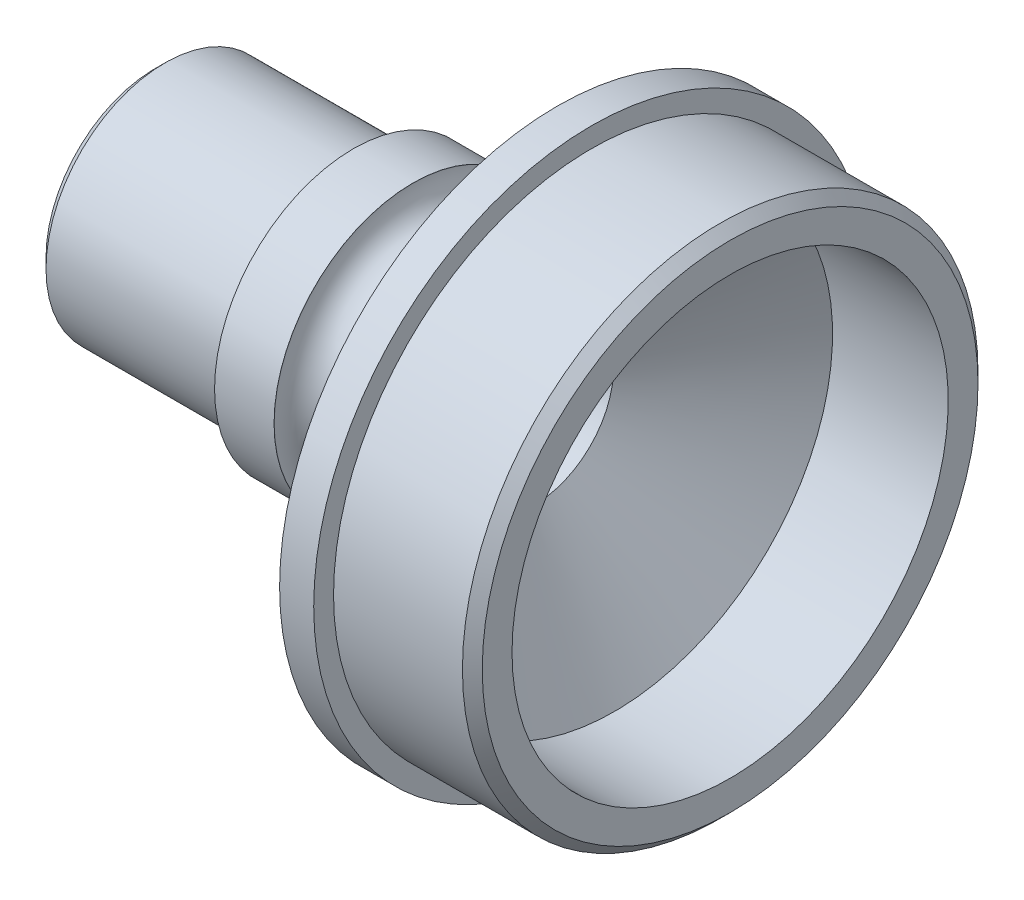
ISO-10303-21;
HEADER;
FILE_DESCRIPTION(('STEP AP214'),'2;1');
FILE_NAME('part.step','',(''),(''),'','','');
FILE_SCHEMA(('AUTOMOTIVE_DESIGN { 1 0 10303 214 1 1 1 1 }'));
ENDSEC;
DATA;
#1=APPLICATION_CONTEXT('core data for automotive mechanical design processes');
#2=APPLICATION_PROTOCOL_DEFINITION('international standard','automotive_design',2000,#1);
#3=PRODUCT_CONTEXT('',#1,'mechanical');
#4=PRODUCT('Part','Part','',(#3));
#5=PRODUCT_RELATED_PRODUCT_CATEGORY('part','',(#4));
#6=PRODUCT_DEFINITION_FORMATION('','',#4);
#7=PRODUCT_DEFINITION_CONTEXT('part definition',#1,'design');
#8=PRODUCT_DEFINITION('design','',#6,#7);
#9=PRODUCT_DEFINITION_SHAPE('','',#8);
#10=(LENGTH_UNIT() NAMED_UNIT(*) SI_UNIT(.MILLI.,.METRE.));
#11=(NAMED_UNIT(*) PLANE_ANGLE_UNIT() SI_UNIT($,.RADIAN.));
#12=(NAMED_UNIT(*) SI_UNIT($,.STERADIAN.) SOLID_ANGLE_UNIT());
#13=UNCERTAINTY_MEASURE_WITH_UNIT(LENGTH_MEASURE(1.E-05),#10,'distance_accuracy_value','');
#14=(GEOMETRIC_REPRESENTATION_CONTEXT(3) GLOBAL_UNCERTAINTY_ASSIGNED_CONTEXT((#13)) GLOBAL_UNIT_ASSIGNED_CONTEXT((#10,
#11,#12)) REPRESENTATION_CONTEXT('',''));
#15=CARTESIAN_POINT('',(0.,0.,0.));
#16=DIRECTION('',(0.,0.,1.));
#17=DIRECTION('',(1.,0.,0.));
#18=AXIS2_PLACEMENT_3D('',#15,#16,#17);
#19=CARTESIAN_POINT('',(-6.13336789882657,0.,0.));
#20=DIRECTION('',(1.,0.,0.));
#21=DIRECTION('',(0.,0.,-1.));
#22=AXIS2_PLACEMENT_3D('',#19,#20,#21);
#23=CONICAL_SURFACE('',#22,6.35604902157912,1.04719755119659);
#24=CARTESIAN_POINT('',(-1.72013074376293,0.,0.));
#25=DIRECTION('',(-1.,0.,0.));
#26=DIRECTION('',(0.,0.,1.));
#27=AXIS2_PLACEMENT_3D('',#24,#25,#26);
#28=CIRCLE('',#27,14.);
#29=CARTESIAN_POINT('',(-1.72013074376293,0.,14.));
#30=VERTEX_POINT('',#29);
#31=EDGE_CURVE('E87',#30,#30,#28,.T.);
#32=ORIENTED_EDGE('',*,*,#31,.T.);
#33=EDGE_LOOP('',(#32));
#34=FACE_BOUND('',#33,.T.);
#35=CARTESIAN_POINT('',(-6.13336789882657,0.,0.));
#36=DIRECTION('',(-1.,0.,0.));
#37=DIRECTION('',(0.,0.,1.));
#38=AXIS2_PLACEMENT_3D('',#35,#36,#37);
#39=CIRCLE('',#38,6.35604902157912);
#40=CARTESIAN_POINT('',(-6.13336789882657,0.,6.35604902157912));
#41=VERTEX_POINT('',#40);
#42=EDGE_CURVE('E51',#41,#41,#39,.T.);
#43=ORIENTED_EDGE('',*,*,#42,.F.);
#44=EDGE_LOOP('',(#43));
#45=FACE_BOUND('',#44,.T.);
#46=ADVANCED_FACE('F32',(#34,#45),#23,.T.);
#47=CARTESIAN_POINT('',(0.,0.,0.));
#48=DIRECTION('',(-1.,0.,0.));
#49=DIRECTION('',(0.,0.,1.));
#50=AXIS2_PLACEMENT_3D('',#47,#48,#49);
#51=CYLINDRICAL_SURFACE('',#50,6.35604902157911);
#52=ORIENTED_EDGE('',*,*,#42,.T.);
#53=EDGE_LOOP('',(#52));
#54=FACE_BOUND('',#53,.T.);
#55=CARTESIAN_POINT('',(-6.14007077130874,0.,0.));
#56=DIRECTION('',(-1.,0.,0.));
#57=DIRECTION('',(0.,0.,1.));
#58=AXIS2_PLACEMENT_3D('',#55,#56,#57);
#59=CIRCLE('',#58,6.35604902157911);
#60=CARTESIAN_POINT('',(-6.14007077130874,0.,6.35604902157911));
#61=VERTEX_POINT('',#60);
#62=EDGE_CURVE('E54',#61,#61,#59,.T.);
#63=ORIENTED_EDGE('',*,*,#62,.F.);
#64=EDGE_LOOP('',(#63));
#65=FACE_BOUND('',#64,.T.);
#66=ADVANCED_FACE('F110',(#54,#65),#51,.T.);
#67=CARTESIAN_POINT('',(-7.5,0.,0.));
#68=DIRECTION('',(-1.,0.,0.));
#69=DIRECTION('',(0.,0.,1.));
#70=AXIS2_PLACEMENT_3D('',#67,#68,#69);
#71=TOROIDAL_SURFACE('',#70,6.98897278709213,1.5);
#72=ORIENTED_EDGE('',*,*,#62,.T.);
#73=EDGE_LOOP('',(#72));
#74=FACE_BOUND('',#73,.T.);
#75=CARTESIAN_POINT('',(-9.,0.,0.));
#76=DIRECTION('',(-1.,0.,0.));
#77=DIRECTION('',(0.,0.,1.));
#78=AXIS2_PLACEMENT_3D('',#75,#76,#77);
#79=CIRCLE('',#78,6.98897278709213);
#80=CARTESIAN_POINT('',(-9.,0.,6.98897278709213));
#81=VERTEX_POINT('',#80);
#82=EDGE_CURVE('E57',#81,#81,#79,.T.);
#83=ORIENTED_EDGE('',*,*,#82,.F.);
#84=EDGE_LOOP('',(#83));
#85=FACE_BOUND('',#84,.T.);
#86=ADVANCED_FACE('F114',(#74,#85),#71,.F.);
#87=CARTESIAN_POINT('',(-9.,7.,0.));
#88=DIRECTION('',(1.,0.,0.));
#89=DIRECTION('',(0.,0.,-1.));
#90=AXIS2_PLACEMENT_3D('',#87,#88,#89);
#91=PLANE('',#90);
#92=ORIENTED_EDGE('',*,*,#82,.T.);
#93=EDGE_LOOP('',(#92));
#94=FACE_BOUND('',#93,.T.);
#95=CARTESIAN_POINT('',(-9.,0.,0.));
#96=DIRECTION('',(-1.,0.,0.));
#97=DIRECTION('',(0.,0.,1.));
#98=AXIS2_PLACEMENT_3D('',#95,#96,#97);
#99=CIRCLE('',#98,7.);
#100=CARTESIAN_POINT('',(-9.,0.,7.));
#101=VERTEX_POINT('',#100);
#102=EDGE_CURVE('E60',#101,#101,#99,.T.);
#103=ORIENTED_EDGE('',*,*,#102,.F.);
#104=EDGE_LOOP('',(#103));
#105=FACE_BOUND('',#104,.T.);
#106=ADVANCED_FACE('F119',(#94,#105),#91,.T.);
#107=CARTESIAN_POINT('',(0.,0.,0.));
#108=DIRECTION('',(-1.,0.,0.));
#109=DIRECTION('',(0.,0.,1.));
#110=AXIS2_PLACEMENT_3D('',#107,#108,#109);
#111=CYLINDRICAL_SURFACE('',#110,7.);
#112=ORIENTED_EDGE('',*,*,#102,.T.);
#113=EDGE_LOOP('',(#112));
#114=FACE_BOUND('',#113,.T.);
#115=CARTESIAN_POINT('',(-12.,0.,0.));
#116=DIRECTION('',(-1.,0.,0.));
#117=DIRECTION('',(0.,0.,1.));
#118=AXIS2_PLACEMENT_3D('',#115,#116,#117);
#119=CIRCLE('',#118,7.);
#120=CARTESIAN_POINT('',(-12.,0.,7.));
#121=VERTEX_POINT('',#120);
#122=EDGE_CURVE('E63',#121,#121,#119,.T.);
#123=ORIENTED_EDGE('',*,*,#122,.F.);
#124=EDGE_LOOP('',(#123));
#125=FACE_BOUND('',#124,.T.);
#126=ADVANCED_FACE('F126',(#114,#125),#111,.T.);
#127=CARTESIAN_POINT('',(-12.,6.,0.));
#128=DIRECTION('',(-1.,0.,0.));
#129=DIRECTION('',(0.,0.,1.));
#130=AXIS2_PLACEMENT_3D('',#127,#128,#129);
#131=PLANE('',#130);
#132=ORIENTED_EDGE('',*,*,#122,.T.);
#133=EDGE_LOOP('',(#132));
#134=FACE_BOUND('',#133,.T.);
#135=CARTESIAN_POINT('',(-12.,0.,0.));
#136=DIRECTION('',(-1.,0.,0.));
#137=DIRECTION('',(0.,0.,1.));
#138=AXIS2_PLACEMENT_3D('',#135,#136,#137);
#139=CIRCLE('',#138,6.);
#140=CARTESIAN_POINT('',(-12.,0.,6.));
#141=VERTEX_POINT('',#140);
#142=EDGE_CURVE('E66',#141,#141,#139,.T.);
#143=ORIENTED_EDGE('',*,*,#142,.F.);
#144=EDGE_LOOP('',(#143));
#145=FACE_BOUND('',#144,.T.);
#146=ADVANCED_FACE('F130',(#134,#145),#131,.T.);
#147=CARTESIAN_POINT('',(0.,0.,0.));
#148=DIRECTION('',(-1.,0.,0.));
#149=DIRECTION('',(0.,0.,1.));
#150=AXIS2_PLACEMENT_3D('',#147,#148,#149);
#151=CYLINDRICAL_SURFACE('',#150,6.);
#152=CARTESIAN_POINT('',(-21.5,0.,0.));
#153=DIRECTION('',(-1.,0.,0.));
#154=DIRECTION('',(0.,0.,1.));
#155=AXIS2_PLACEMENT_3D('',#152,#153,#154);
#156=CIRCLE('',#155,6.);
#157=CARTESIAN_POINT('',(-21.5,0.,6.));
#158=VERTEX_POINT('',#157);
#159=EDGE_CURVE('E10',#158,#158,#156,.F.);
#160=ORIENTED_EDGE('',*,*,#159,.T.);
#161=EDGE_LOOP('',(#160));
#162=FACE_BOUND('',#161,.T.);
#163=ORIENTED_EDGE('',*,*,#142,.T.);
#164=EDGE_LOOP('',(#163));
#165=FACE_BOUND('',#164,.T.);
#166=ADVANCED_FACE('F134',(#162,#165),#151,.T.);
#167=CARTESIAN_POINT('',(-22.,4.,0.));
#168=DIRECTION('',(-1.,0.,0.));
#169=DIRECTION('',(0.,0.,1.));
#170=AXIS2_PLACEMENT_3D('',#167,#168,#169);
#171=PLANE('',#170);
#172=CARTESIAN_POINT('',(-22.,0.,0.));
#173=DIRECTION('',(-1.,0.,0.));
#174=DIRECTION('',(0.,0.,1.));
#175=AXIS2_PLACEMENT_3D('',#172,#173,#174);
#176=CIRCLE('',#175,5.49999999999999);
#177=CARTESIAN_POINT('',(-22.,0.,5.49999999999999));
#178=VERTEX_POINT('',#177);
#179=EDGE_CURVE('E38',#178,#178,#176,.T.);
#180=ORIENTED_EDGE('',*,*,#179,.T.);
#181=EDGE_LOOP('',(#180));
#182=FACE_BOUND('',#181,.T.);
#183=CARTESIAN_POINT('',(-22.,0.,0.));
#184=DIRECTION('',(-1.,0.,0.));
#185=DIRECTION('',(0.,0.,1.));
#186=AXIS2_PLACEMENT_3D('',#183,#184,#185);
#187=CIRCLE('',#186,4.);
#188=CARTESIAN_POINT('',(-22.,0.,4.));
#189=VERTEX_POINT('',#188);
#190=EDGE_CURVE('E69',#189,#189,#187,.T.);
#191=ORIENTED_EDGE('',*,*,#190,.F.);
#192=EDGE_LOOP('',(#191));
#193=FACE_BOUND('',#192,.T.);
#194=ADVANCED_FACE('F138',(#182,#193),#171,.T.);
#195=CARTESIAN_POINT('',(0.,0.,0.));
#196=DIRECTION('',(-1.,0.,0.));
#197=DIRECTION('',(0.,0.,1.));
#198=AXIS2_PLACEMENT_3D('',#195,#196,#197);
#199=CYLINDRICAL_SURFACE('',#198,4.);
#200=ORIENTED_EDGE('',*,*,#190,.T.);
#201=EDGE_LOOP('',(#200));
#202=FACE_BOUND('',#201,.T.);
#203=CARTESIAN_POINT('',(-2.87483128214223,0.,0.));
#204=DIRECTION('',(-1.,0.,0.));
#205=DIRECTION('',(0.,0.,1.));
#206=AXIS2_PLACEMENT_3D('',#203,#204,#205);
#207=CIRCLE('',#206,4.);
#208=CARTESIAN_POINT('',(-2.87483128214223,0.,4.));
#209=VERTEX_POINT('',#208);
#210=EDGE_CURVE('E72',#209,#209,#207,.T.);
#211=ORIENTED_EDGE('',*,*,#210,.F.);
#212=EDGE_LOOP('',(#211));
#213=FACE_BOUND('',#212,.T.);
#214=ADVANCED_FACE('F141',(#202,#213),#199,.F.);
#215=CARTESIAN_POINT('',(1.16662060218519,0.,0.));
#216=DIRECTION('',(1.,0.,0.));
#217=DIRECTION('',(0.,0.,-1.));
#218=AXIS2_PLACEMENT_3D('',#215,#216,#217);
#219=CONICAL_SURFACE('',#218,11.,1.04719755119659);
#220=ORIENTED_EDGE('',*,*,#210,.T.);
#221=EDGE_LOOP('',(#220));
#222=FACE_BOUND('',#221,.T.);
#223=CARTESIAN_POINT('',(1.16662060218519,0.,0.));
#224=DIRECTION('',(-1.,0.,0.));
#225=DIRECTION('',(0.,0.,1.));
#226=AXIS2_PLACEMENT_3D('',#223,#224,#225);
#227=CIRCLE('',#226,11.);
#228=CARTESIAN_POINT('',(1.16662060218519,0.,11.));
#229=VERTEX_POINT('',#228);
#230=EDGE_CURVE('E75',#229,#229,#227,.T.);
#231=ORIENTED_EDGE('',*,*,#230,.F.);
#232=EDGE_LOOP('',(#231));
#233=FACE_BOUND('',#232,.T.);
#234=ADVANCED_FACE('F144',(#222,#233),#219,.F.);
#235=CARTESIAN_POINT('',(0.,0.,0.));
#236=DIRECTION('',(-1.,0.,0.));
#237=DIRECTION('',(0.,0.,1.));
#238=AXIS2_PLACEMENT_3D('',#235,#236,#237);
#239=CYLINDRICAL_SURFACE('',#238,11.);
#240=ORIENTED_EDGE('',*,*,#230,.T.);
#241=EDGE_LOOP('',(#240));
#242=FACE_BOUND('',#241,.T.);
#243=CARTESIAN_POINT('',(7.,0.,0.));
#244=DIRECTION('',(-1.,0.,0.));
#245=DIRECTION('',(0.,0.,1.));
#246=AXIS2_PLACEMENT_3D('',#243,#244,#245);
#247=CIRCLE('',#246,11.);
#248=CARTESIAN_POINT('',(7.,0.,11.));
#249=VERTEX_POINT('',#248);
#250=EDGE_CURVE('E78',#249,#249,#247,.T.);
#251=ORIENTED_EDGE('',*,*,#250,.F.);
#252=EDGE_LOOP('',(#251));
#253=FACE_BOUND('',#252,.T.);
#254=ADVANCED_FACE('F148',(#242,#253),#239,.F.);
#255=CARTESIAN_POINT('',(7.,13.,0.));
#256=DIRECTION('',(1.,0.,0.));
#257=DIRECTION('',(0.,0.,-1.));
#258=AXIS2_PLACEMENT_3D('',#255,#256,#257);
#259=PLANE('',#258);
#260=CARTESIAN_POINT('',(7.,0.,0.));
#261=DIRECTION('',(1.,0.,0.));
#262=DIRECTION('',(0.,0.,-1.));
#263=AXIS2_PLACEMENT_3D('',#260,#261,#262);
#264=CIRCLE('',#263,12.5);
#265=CARTESIAN_POINT('',(7.,0.,-12.5));
#266=VERTEX_POINT('',#265);
#267=EDGE_CURVE('E42',#266,#266,#264,.T.);
#268=ORIENTED_EDGE('',*,*,#267,.T.);
#269=EDGE_LOOP('',(#268));
#270=FACE_BOUND('',#269,.T.);
#271=ORIENTED_EDGE('',*,*,#250,.T.);
#272=EDGE_LOOP('',(#271));
#273=FACE_BOUND('',#272,.T.);
#274=ADVANCED_FACE('F152',(#270,#273),#259,.T.);
#275=CARTESIAN_POINT('',(0.,0.,0.));
#276=DIRECTION('',(-1.,0.,0.));
#277=DIRECTION('',(0.,0.,1.));
#278=AXIS2_PLACEMENT_3D('',#275,#276,#277);
#279=CYLINDRICAL_SURFACE('',#278,13.);
#280=CARTESIAN_POINT('',(6.49999999999999,0.,0.));
#281=DIRECTION('',(1.,0.,0.));
#282=DIRECTION('',(0.,0.,-1.));
#283=AXIS2_PLACEMENT_3D('',#280,#281,#282);
#284=CIRCLE('',#283,13.);
#285=CARTESIAN_POINT('',(6.49999999999999,0.,-13.));
#286=VERTEX_POINT('',#285);
#287=EDGE_CURVE('E46',#286,#286,#284,.F.);
#288=ORIENTED_EDGE('',*,*,#287,.T.);
#289=EDGE_LOOP('',(#288));
#290=FACE_BOUND('',#289,.T.);
#291=CARTESIAN_POINT('',(0.,0.,0.));
#292=DIRECTION('',(-1.,0.,0.));
#293=DIRECTION('',(0.,0.,1.));
#294=AXIS2_PLACEMENT_3D('',#291,#292,#293);
#295=CIRCLE('',#294,13.);
#296=CARTESIAN_POINT('',(0.,0.,13.));
#297=VERTEX_POINT('',#296);
#298=EDGE_CURVE('E81',#297,#297,#295,.T.);
#299=ORIENTED_EDGE('',*,*,#298,.F.);
#300=EDGE_LOOP('',(#299));
#301=FACE_BOUND('',#300,.T.);
#302=ADVANCED_FACE('F106',(#290,#301),#279,.T.);
#303=CARTESIAN_POINT('',(0.,14.,0.));
#304=DIRECTION('',(1.,0.,0.));
#305=DIRECTION('',(0.,0.,-1.));
#306=AXIS2_PLACEMENT_3D('',#303,#304,#305);
#307=PLANE('',#306);
#308=ORIENTED_EDGE('',*,*,#298,.T.);
#309=EDGE_LOOP('',(#308));
#310=FACE_BOUND('',#309,.T.);
#311=CARTESIAN_POINT('',(0.,0.,0.));
#312=DIRECTION('',(-1.,0.,0.));
#313=DIRECTION('',(0.,0.,1.));
#314=AXIS2_PLACEMENT_3D('',#311,#312,#313);
#315=CIRCLE('',#314,14.);
#316=CARTESIAN_POINT('',(0.,0.,14.));
#317=VERTEX_POINT('',#316);
#318=EDGE_CURVE('E84',#317,#317,#315,.T.);
#319=ORIENTED_EDGE('',*,*,#318,.F.);
#320=EDGE_LOOP('',(#319));
#321=FACE_BOUND('',#320,.T.);
#322=ADVANCED_FACE('F96',(#310,#321),#307,.T.);
#323=CARTESIAN_POINT('',(0.,0.,0.));
#324=DIRECTION('',(-1.,0.,0.));
#325=DIRECTION('',(0.,0.,1.));
#326=AXIS2_PLACEMENT_3D('',#323,#324,#325);
#327=CYLINDRICAL_SURFACE('',#326,14.);
#328=ORIENTED_EDGE('',*,*,#318,.T.);
#329=EDGE_LOOP('',(#328));
#330=FACE_BOUND('',#329,.T.);
#331=ORIENTED_EDGE('',*,*,#31,.F.);
#332=EDGE_LOOP('',(#331));
#333=FACE_BOUND('',#332,.T.);
#334=ADVANCED_FACE('F93',(#330,#333),#327,.T.);
#335=CARTESIAN_POINT('',(6.49999999999999,0.,0.));
#336=DIRECTION('',(-1.,0.,0.));
#337=DIRECTION('',(0.,0.,1.));
#338=AXIS2_PLACEMENT_3D('',#335,#336,#337);
#339=CONICAL_SURFACE('',#338,13.,0.785398163397443);
#340=ORIENTED_EDGE('',*,*,#267,.F.);
#341=EDGE_LOOP('',(#340));
#342=FACE_BOUND('',#341,.T.);
#343=ORIENTED_EDGE('',*,*,#287,.F.);
#344=EDGE_LOOP('',(#343));
#345=FACE_BOUND('',#344,.T.);
#346=ADVANCED_FACE('F95',(#342,#345),#339,.T.);
#347=CARTESIAN_POINT('',(-22.,0.,0.));
#348=DIRECTION('',(1.,0.,0.));
#349=DIRECTION('',(0.,0.,-1.));
#350=AXIS2_PLACEMENT_3D('',#347,#348,#349);
#351=CONICAL_SURFACE('',#350,5.49999999999999,0.785398163397453);
#352=ORIENTED_EDGE('',*,*,#159,.F.);
#353=EDGE_LOOP('',(#352));
#354=FACE_BOUND('',#353,.T.);
#355=ORIENTED_EDGE('',*,*,#179,.F.);
#356=EDGE_LOOP('',(#355));
#357=FACE_BOUND('',#356,.T.);
#358=ADVANCED_FACE('F103',(#354,#357),#351,.T.);
#359=CLOSED_SHELL('',(#46,#66,#86,#106,#126,#146,#166,#194,#214,#234,#254,#274,#302,#322,#334,
#346,#358));
#360=MANIFOLD_SOLID_BREP('B2',#359);
#361=ADVANCED_BREP_SHAPE_REPRESENTATION('',(#18,#360),#14);
#362=SHAPE_DEFINITION_REPRESENTATION(#9,#361);
ENDSEC;
END-ISO-10303-21;
